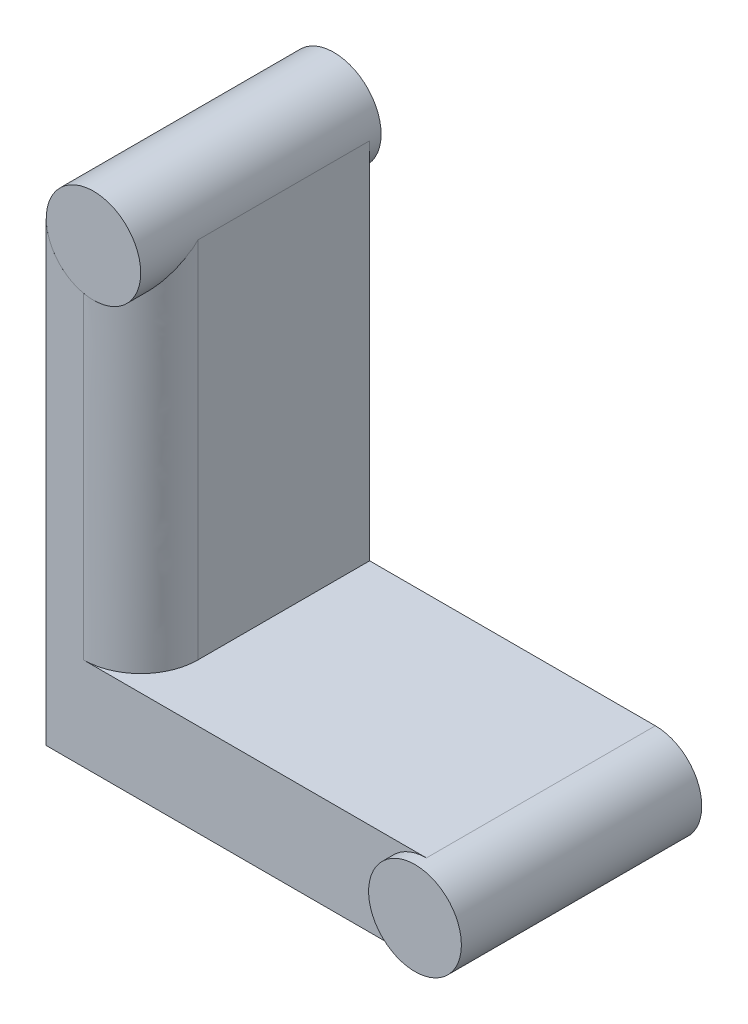
ISO-10303-21;
HEADER;
FILE_DESCRIPTION(('STEP AP214'),'2;1');
FILE_NAME('part.step','',(''),(''),'','','');
FILE_SCHEMA(('AUTOMOTIVE_DESIGN { 1 0 10303 214 1 1 1 1 }'));
ENDSEC;
DATA;
#1=APPLICATION_CONTEXT('core data for automotive mechanical design processes');
#2=APPLICATION_PROTOCOL_DEFINITION('international standard','automotive_design',2000,#1);
#3=PRODUCT_CONTEXT('',#1,'mechanical');
#4=PRODUCT('Part','Part','',(#3));
#5=PRODUCT_RELATED_PRODUCT_CATEGORY('part','',(#4));
#6=PRODUCT_DEFINITION_FORMATION('','',#4);
#7=PRODUCT_DEFINITION_CONTEXT('part definition',#1,'design');
#8=PRODUCT_DEFINITION('design','',#6,#7);
#9=PRODUCT_DEFINITION_SHAPE('','',#8);
#10=(LENGTH_UNIT() NAMED_UNIT(*) SI_UNIT(.MILLI.,.METRE.));
#11=(NAMED_UNIT(*) PLANE_ANGLE_UNIT() SI_UNIT($,.RADIAN.));
#12=(NAMED_UNIT(*) SI_UNIT($,.STERADIAN.) SOLID_ANGLE_UNIT());
#13=UNCERTAINTY_MEASURE_WITH_UNIT(LENGTH_MEASURE(1.E-05),#10,'distance_accuracy_value','');
#14=(GEOMETRIC_REPRESENTATION_CONTEXT(3) GLOBAL_UNCERTAINTY_ASSIGNED_CONTEXT((#13)) GLOBAL_UNIT_ASSIGNED_CONTEXT((#10,
#11,#12)) REPRESENTATION_CONTEXT('',''));
#15=CARTESIAN_POINT('',(0.,0.,0.));
#16=DIRECTION('',(0.,0.,1.));
#17=DIRECTION('',(1.,0.,0.));
#18=AXIS2_PLACEMENT_3D('',#15,#16,#17);
#19=CARTESIAN_POINT('',(8.25386471990466,37.4415375446961,-2.));
#20=DIRECTION('',(0.,0.,1.));
#21=DIRECTION('',(1.,0.,0.));
#22=AXIS2_PLACEMENT_3D('',#19,#20,#21);
#23=CYLINDRICAL_SURFACE('',#22,8.25386471990466);
#24=CARTESIAN_POINT('',(8.25386471990466,37.4415375446961,-2.));
#25=DIRECTION('',(0.,0.,1.));
#26=DIRECTION('',(1.,0.,0.));
#27=AXIS2_PLACEMENT_3D('',#24,#25,#26);
#28=CIRCLE('',#27,8.25386471990466);
#29=CARTESIAN_POINT('',(16.5077294398093,37.4415375446961,-2.));
#30=VERTEX_POINT('',#29);
#31=EDGE_CURVE('E11',#30,#30,#28,.T.);
#32=CARTESIAN_POINT('',(8.25386471990466,37.4415375446961,40.));
#33=DIRECTION('',(0.,0.,1.));
#34=DIRECTION('',(1.,0.,0.));
#35=AXIS2_PLACEMENT_3D('',#32,#33,#34);
#36=CIRCLE('',#35,8.25386471990466);
#37=CARTESIAN_POINT('',(16.5077294398093,37.4415375446961,40.));
#38=VERTEX_POINT('',#37);
#39=EDGE_CURVE('E52',#38,#38,#36,.T.);
#40=CARTESIAN_POINT('',(16.5077294398093,37.4415375446961,-2.));
#41=CARTESIAN_POINT('',(16.5077294398093,37.4415375446961,-1.5625));
#42=CARTESIAN_POINT('',(16.5077294398093,37.4415375446961,-1.125));
#43=CARTESIAN_POINT('',(16.5077294398093,37.4415375446961,-0.250000000000002));
#44=CARTESIAN_POINT('',(16.5077294398093,37.4415375446961,0.187499999999998));
#45=CARTESIAN_POINT('',(16.5077294398093,37.4415375446961,1.0625));
#46=CARTESIAN_POINT('',(16.5077294398093,37.4415375446961,1.5));
#47=CARTESIAN_POINT('',(16.5077294398093,37.4415375446961,2.375));
#48=CARTESIAN_POINT('',(16.5077294398093,37.4415375446961,2.8125));
#49=CARTESIAN_POINT('',(16.5077294398093,37.4415375446961,3.6875));
#50=CARTESIAN_POINT('',(16.5077294398093,37.4415375446961,4.125));
#51=CARTESIAN_POINT('',(16.5077294398093,37.4415375446961,5.));
#52=CARTESIAN_POINT('',(16.5077294398093,37.4415375446961,5.4375));
#53=CARTESIAN_POINT('',(16.5077294398093,37.4415375446961,6.3125));
#54=CARTESIAN_POINT('',(16.5077294398093,37.4415375446961,6.75));
#55=CARTESIAN_POINT('',(16.5077294398093,37.4415375446961,7.625));
#56=CARTESIAN_POINT('',(16.5077294398093,37.4415375446961,8.0625));
#57=CARTESIAN_POINT('',(16.5077294398093,37.4415375446961,8.9375));
#58=CARTESIAN_POINT('',(16.5077294398093,37.4415375446961,9.375));
#59=CARTESIAN_POINT('',(16.5077294398093,37.4415375446961,10.25));
#60=CARTESIAN_POINT('',(16.5077294398093,37.4415375446961,10.6875));
#61=CARTESIAN_POINT('',(16.5077294398093,37.4415375446961,11.5625));
#62=CARTESIAN_POINT('',(16.5077294398093,37.4415375446961,12.));
#63=CARTESIAN_POINT('',(16.5077294398093,37.4415375446961,12.875));
#64=CARTESIAN_POINT('',(16.5077294398093,37.4415375446961,13.3125));
#65=CARTESIAN_POINT('',(16.5077294398093,37.4415375446961,14.1875));
#66=CARTESIAN_POINT('',(16.5077294398093,37.4415375446961,14.625));
#67=CARTESIAN_POINT('',(16.5077294398093,37.4415375446961,15.5));
#68=CARTESIAN_POINT('',(16.5077294398093,37.4415375446961,15.9375));
#69=CARTESIAN_POINT('',(16.5077294398093,37.4415375446961,16.8125));
#70=CARTESIAN_POINT('',(16.5077294398093,37.4415375446961,17.25));
#71=CARTESIAN_POINT('',(16.5077294398093,37.4415375446961,18.125));
#72=CARTESIAN_POINT('',(16.5077294398093,37.4415375446961,18.5625));
#73=CARTESIAN_POINT('',(16.5077294398093,37.4415375446961,19.4375));
#74=CARTESIAN_POINT('',(16.5077294398093,37.4415375446961,19.875));
#75=CARTESIAN_POINT('',(16.5077294398093,37.4415375446961,20.75));
#76=CARTESIAN_POINT('',(16.5077294398093,37.4415375446961,21.1875));
#77=CARTESIAN_POINT('',(16.5077294398093,37.4415375446961,22.0625));
#78=CARTESIAN_POINT('',(16.5077294398093,37.4415375446961,22.5));
#79=CARTESIAN_POINT('',(16.5077294398093,37.4415375446961,23.375));
#80=CARTESIAN_POINT('',(16.5077294398093,37.4415375446961,23.8125));
#81=CARTESIAN_POINT('',(16.5077294398093,37.4415375446961,24.6875));
#82=CARTESIAN_POINT('',(16.5077294398093,37.4415375446961,25.125));
#83=CARTESIAN_POINT('',(16.5077294398093,37.4415375446961,26.));
#84=CARTESIAN_POINT('',(16.5077294398093,37.4415375446961,26.4375));
#85=CARTESIAN_POINT('',(16.5077294398093,37.4415375446961,27.3125));
#86=CARTESIAN_POINT('',(16.5077294398093,37.4415375446961,27.75));
#87=CARTESIAN_POINT('',(16.5077294398093,37.4415375446961,28.625));
#88=CARTESIAN_POINT('',(16.5077294398093,37.4415375446961,29.0625));
#89=CARTESIAN_POINT('',(16.5077294398093,37.4415375446961,29.9375));
#90=CARTESIAN_POINT('',(16.5077294398093,37.4415375446961,30.375));
#91=CARTESIAN_POINT('',(16.5077294398093,37.4415375446961,31.25));
#92=CARTESIAN_POINT('',(16.5077294398093,37.4415375446961,31.6875));
#93=CARTESIAN_POINT('',(16.5077294398093,37.4415375446961,32.5625));
#94=CARTESIAN_POINT('',(16.5077294398093,37.4415375446961,33.));
#95=CARTESIAN_POINT('',(16.5077294398093,37.4415375446961,33.875));
#96=CARTESIAN_POINT('',(16.5077294398093,37.4415375446961,34.3125));
#97=CARTESIAN_POINT('',(16.5077294398093,37.4415375446961,35.1875));
#98=CARTESIAN_POINT('',(16.5077294398093,37.4415375446961,35.625));
#99=CARTESIAN_POINT('',(16.5077294398093,37.4415375446961,36.5));
#100=CARTESIAN_POINT('',(16.5077294398093,37.4415375446961,36.9375));
#101=CARTESIAN_POINT('',(16.5077294398093,37.4415375446961,37.8125));
#102=CARTESIAN_POINT('',(16.5077294398093,37.4415375446961,38.25));
#103=CARTESIAN_POINT('',(16.5077294398093,37.4415375446961,39.125));
#104=CARTESIAN_POINT('',(16.5077294398093,37.4415375446961,39.5625));
#105=CARTESIAN_POINT('',(16.5077294398093,37.4415375446961,40.));
#106=B_SPLINE_CURVE_WITH_KNOTS('',3,(#40,#41,#42,#43,#44,#45,#46,#47,#48,#49,#50,#51,#52,#53,
#54,#55,#56,#57,#58,#59,#60,#61,#62,#63,#64,#65,#66,#67,#68,#69,#70,#71,#72,#73,#74,#75,#76,#77,
#78,#79,#80,#81,#82,#83,#84,#85,#86,#87,#88,#89,#90,#91,#92,#93,#94,#95,#96,#97,#98,#99,#100,
#101,#102,#103,#104,#105),.UNSPECIFIED.,.F.,.F.,(4,2,2,2,2,2,2,2,2,2,2,2,2,2,2,2,2,2,2,2,2,2,2,
2,2,2,2,2,2,2,2,2,4),(0.,1.3125,2.625,3.9375,5.25,6.5625,7.875,9.1875,10.5,11.8125,13.125,
14.4375,15.75,17.0625,18.375,19.6875,21.,22.3125,23.625,24.9375,26.25,27.5625,28.875,30.1875,
31.5,32.8125,34.125,35.4375,36.75,38.0625,39.375,40.6875,42.),.UNSPECIFIED.);
#107=EDGE_CURVE('BSEAM49',#30,#38,#106,.T.);
#108=ORIENTED_EDGE('',*,*,#31,.T.);
#109=ORIENTED_EDGE('',*,*,#39,.F.);
#110=ORIENTED_EDGE('',*,*,#107,.T.);
#111=ORIENTED_EDGE('',*,*,#107,.F.);
#112=EDGE_LOOP('',(#108,#110,#109,#111));
#113=FACE_BOUND('',#112,.T.);
#114=ADVANCED_FACE('F49',(#113),#23,.T.);
#115=CARTESIAN_POINT('',(8.25386471990466,37.4415375446961,-2.));
#116=DIRECTION('',(0.,0.,1.));
#117=DIRECTION('',(1.,0.,0.));
#118=AXIS2_PLACEMENT_3D('',#115,#116,#117);
#119=PLANE('',#118);
#120=ORIENTED_EDGE('',*,*,#31,.F.);
#121=EDGE_LOOP('',(#120));
#122=FACE_BOUND('',#121,.T.);
#123=ADVANCED_FACE('F63',(#122),#119,.F.);
#124=CARTESIAN_POINT('',(8.25386471990466,37.4415375446961,40.));
#125=DIRECTION('',(0.,0.,1.));
#126=DIRECTION('',(1.,0.,0.));
#127=AXIS2_PLACEMENT_3D('',#124,#125,#126);
#128=PLANE('',#127);
#129=ORIENTED_EDGE('',*,*,#39,.T.);
#130=EDGE_LOOP('',(#129));
#131=FACE_BOUND('',#130,.T.);
#132=ADVANCED_FACE('F65',(#131),#128,.T.);
#133=CLOSED_SHELL('',(#114,#123,#132));
#134=MANIFOLD_SOLID_BREP('B2',#133);
#135=CARTESIAN_POINT('',(0.,-42.330810488677,40.));
#136=DIRECTION('',(0.,1.,0.));
#137=DIRECTION('',(0.,0.,1.));
#138=AXIS2_PLACEMENT_3D('',#135,#136,#137);
#139=PLANE('',#138);
#140=DIRECTION('',(1.,0.,0.));
#141=VECTOR('',#140,1.);
#142=CARTESIAN_POINT('',(0.,-42.330810488677,0.));
#143=LINE('',#142,#141);
#144=CARTESIAN_POINT('',(0.,-42.330810488677,0.));
#145=VERTEX_POINT('',#144);
#146=CARTESIAN_POINT('',(66.429779499404,-42.330810488677,0.));
#147=VERTEX_POINT('',#146);
#148=EDGE_CURVE('E183',#145,#147,#143,.T.);
#149=ORIENTED_EDGE('',*,*,#148,.T.);
#150=DIRECTION('',(0.,0.,-1.));
#151=VECTOR('',#150,1.);
#152=CARTESIAN_POINT('',(66.429779499404,-42.330810488677,40.));
#153=LINE('',#152,#151);
#154=CARTESIAN_POINT('',(66.429779499404,-42.330810488677,40.));
#155=VERTEX_POINT('',#154);
#156=EDGE_CURVE('E165',#155,#147,#153,.T.);
#157=ORIENTED_EDGE('',*,*,#156,.F.);
#158=DIRECTION('',(1.,0.,0.));
#159=VECTOR('',#158,1.);
#160=CARTESIAN_POINT('',(0.,-42.330810488677,40.));
#161=LINE('',#160,#159);
#162=CARTESIAN_POINT('',(0.,-42.330810488677,40.));
#163=VERTEX_POINT('',#162);
#164=EDGE_CURVE('E191',#163,#155,#161,.T.);
#165=ORIENTED_EDGE('',*,*,#164,.F.);
#166=DIRECTION('',(0.,0.,-1.));
#167=VECTOR('',#166,1.);
#168=CARTESIAN_POINT('',(0.,-42.330810488677,40.));
#169=LINE('',#168,#167);
#170=EDGE_CURVE('E193',#163,#145,#169,.T.);
#171=ORIENTED_EDGE('',*,*,#170,.T.);
#172=EDGE_LOOP('',(#149,#157,#165,#171));
#173=FACE_BOUND('',#172,.T.);
#174=ADVANCED_FACE('F95',(#173),#139,.F.);
#175=CARTESIAN_POINT('',(66.429779499404,-26.119010727056,40.));
#176=DIRECTION('',(0.,-1.,0.));
#177=DIRECTION('',(0.,0.,-1.));
#178=AXIS2_PLACEMENT_3D('',#175,#176,#177);
#179=PLANE('',#178);
#180=DIRECTION('',(-1.,0.,0.));
#181=VECTOR('',#180,1.);
#182=CARTESIAN_POINT('',(66.429779499404,-26.119010727056,0.));
#183=LINE('',#182,#181);
#184=CARTESIAN_POINT('',(66.429779499404,-26.119010727056,0.));
#185=VERTEX_POINT('',#184);
#186=CARTESIAN_POINT('',(16.5077294398093,-26.119010727056,0.));
#187=VERTEX_POINT('',#186);
#188=EDGE_CURVE('E174',#185,#187,#183,.T.);
#189=ORIENTED_EDGE('',*,*,#188,.T.);
#190=DIRECTION('',(0.,0.,-1.));
#191=VECTOR('',#190,1.);
#192=CARTESIAN_POINT('',(16.5077294398093,-26.119010727056,40.));
#193=LINE('',#192,#191);
#194=CARTESIAN_POINT('',(16.5077294398093,-26.119010727056,30.));
#195=VERTEX_POINT('',#194);
#196=EDGE_CURVE('E178',#195,#187,#193,.T.);
#197=ORIENTED_EDGE('',*,*,#196,.F.);
#198=CARTESIAN_POINT('',(6.50772943980932,-26.119010727056,40.));
#199=CARTESIAN_POINT('',(16.5077294398093,-26.119010727056,40.));
#200=CARTESIAN_POINT('',(16.5077294398093,-26.119010727056,30.));
#201=(BOUNDED_CURVE() B_SPLINE_CURVE(2,(#198,#199,#200),.UNSPECIFIED.,.F.,
.F.) B_SPLINE_CURVE_WITH_KNOTS((3,3),(0.,1.),
.UNSPECIFIED.) CURVE() GEOMETRIC_REPRESENTATION_ITEM() RATIONAL_B_SPLINE_CURVE((1.,
0.707106781186548,1.)) REPRESENTATION_ITEM(''));
#202=CARTESIAN_POINT('',(6.50772943980932,-26.119010727056,40.));
#203=VERTEX_POINT('',#202);
#204=EDGE_CURVE('E48',#195,#203,#201,.F.);
#205=ORIENTED_EDGE('',*,*,#204,.T.);
#206=DIRECTION('',(-1.,0.,0.));
#207=VECTOR('',#206,1.);
#208=CARTESIAN_POINT('',(66.429779499404,-26.119010727056,40.));
#209=LINE('',#208,#207);
#210=CARTESIAN_POINT('',(66.429779499404,-26.119010727056,40.));
#211=VERTEX_POINT('',#210);
#212=EDGE_CURVE('E180',#211,#203,#209,.T.);
#213=ORIENTED_EDGE('',*,*,#212,.F.);
#214=DIRECTION('',(0.,0.,-1.));
#215=VECTOR('',#214,1.);
#216=CARTESIAN_POINT('',(66.429779499404,-26.119010727056,40.));
#217=LINE('',#216,#215);
#218=EDGE_CURVE('E163',#211,#185,#217,.T.);
#219=ORIENTED_EDGE('',*,*,#218,.T.);
#220=EDGE_LOOP('',(#189,#197,#205,#213,#219));
#221=FACE_BOUND('',#220,.T.);
#222=ADVANCED_FACE('F172',(#221),#179,.F.);
#223=CARTESIAN_POINT('',(16.5077294398093,-26.119010727056,40.));
#224=DIRECTION('',(-1.,0.,0.));
#225=DIRECTION('',(0.,0.,1.));
#226=AXIS2_PLACEMENT_3D('',#223,#224,#225);
#227=PLANE('',#226);
#228=DIRECTION('',(0.,0.,-1.));
#229=VECTOR('',#228,1.);
#230=CARTESIAN_POINT('',(16.5077294398093,37.4415375446961,40.));
#231=LINE('',#230,#229);
#232=CARTESIAN_POINT('',(16.5077294398093,37.4415375446961,30.));
#233=VERTEX_POINT('',#232);
#234=CARTESIAN_POINT('',(16.5077294398093,37.4415375446961,0.));
#235=VERTEX_POINT('',#234);
#236=EDGE_CURVE('E204',#233,#235,#231,.T.);
#237=ORIENTED_EDGE('',*,*,#236,.F.);
#238=CARTESIAN_POINT('',(16.5077294398093,-29.2970381406436,30.));
#239=CARTESIAN_POINT('',(16.5077294398093,-5.99150377433455,30.));
#240=CARTESIAN_POINT('',(16.5077294398093,17.3140305919746,30.));
#241=CARTESIAN_POINT('',(16.5077294398093,40.6195649582837,30.));
#242=(BOUNDED_CURVE() B_SPLINE_CURVE(3,(#238,#239,#240,#241),.UNSPECIFIED.,.F.,
.F.) B_SPLINE_CURVE_WITH_KNOTS((4,4),(-0.0748444755661502,-0.00492787246722289),
.UNSPECIFIED.) CURVE() GEOMETRIC_REPRESENTATION_ITEM() RATIONAL_B_SPLINE_CURVE((1.,1.,1.,1.)) REPRESENTATION_ITEM(''));
#243=EDGE_CURVE('E106',#233,#195,#242,.F.);
#244=ORIENTED_EDGE('',*,*,#243,.T.);
#245=ORIENTED_EDGE('',*,*,#196,.T.);
#246=DIRECTION('',(0.,1.,0.));
#247=VECTOR('',#246,1.);
#248=CARTESIAN_POINT('',(16.5077294398093,-26.119010727056,0.));
#249=LINE('',#248,#247);
#250=EDGE_CURVE('E182',#187,#235,#249,.T.);
#251=ORIENTED_EDGE('',*,*,#250,.T.);
#252=EDGE_LOOP('',(#237,#244,#245,#251));
#253=FACE_BOUND('',#252,.T.);
#254=ADVANCED_FACE('F226',(#253),#227,.F.);
#255=CARTESIAN_POINT('',(8.25386471990466,37.4415375446961,40.));
#256=DIRECTION('',(0.,0.,-1.));
#257=DIRECTION('',(-1.,0.,0.));
#258=AXIS2_PLACEMENT_3D('',#255,#256,#257);
#259=CYLINDRICAL_SURFACE('',#258,8.25386471990466);
#260=CARTESIAN_POINT('',(8.25386471990466,37.4415375446961,40.));
#261=DIRECTION('',(0.,0.,-1.));
#262=DIRECTION('',(1.,0.,0.));
#263=AXIS2_PLACEMENT_3D('',#260,#261,#262);
#264=CIRCLE('',#263,8.25386471990466);
#265=CARTESIAN_POINT('',(6.50772943980932,29.3744876255439,40.));
#266=VERTEX_POINT('',#265);
#267=CARTESIAN_POINT('',(0.,37.4415375446961,40.));
#268=VERTEX_POINT('',#267);
#269=EDGE_CURVE('E292',#266,#268,#264,.T.);
#270=ORIENTED_EDGE('',*,*,#269,.F.);
#271=CARTESIAN_POINT('',(16.5077294398093,37.4415375446961,30.));
#272=CARTESIAN_POINT('',(16.5077248458745,37.2595049508571,30.2000988227831));
#273=CARTESIAN_POINT('',(16.5017228505918,37.0775374470663,30.4002980999907));
#274=CARTESIAN_POINT('',(16.4755496817082,36.6822347240723,30.8355179167807));
#275=CARTESIAN_POINT('',(16.4530784878085,36.468994249373,31.0704887071536));
#276=CARTESIAN_POINT('',(16.4050259976996,36.1378815098516,31.4355787114182));
#277=CARTESIAN_POINT('',(16.3852221507021,36.0195676178505,31.566080489722));
#278=CARTESIAN_POINT('',(16.3438051112881,35.8016376004174,31.8066972215504));
#279=CARTESIAN_POINT('',(16.32293639335,35.7019393701873,31.916866345903));
#280=CARTESIAN_POINT('',(16.2542027129735,35.4019745325798,32.2489066646719));
#281=CARTESIAN_POINT('',(16.2004731385662,35.2025882306316,32.4703864558893));
#282=CARTESIAN_POINT('',(16.0768845936266,34.8032602401186,32.912852440165));
#283=CARTESIAN_POINT('',(16.0068573473511,34.6033358964416,33.1338073470961));
#284=CARTESIAN_POINT('',(15.8836828257588,34.290078452645,33.479886499956));
#285=CARTESIAN_POINT('',(15.8358878020273,34.1758166445561,33.6060923000747));
#286=CARTESIAN_POINT('',(15.7360999790361,33.9523449591851,33.8541525205278));
#287=CARTESIAN_POINT('',(15.6842696811532,33.8430847996684,33.9760267482048));
#288=CARTESIAN_POINT('',(15.5769249978851,33.6294096729469,34.2150135185041));
#289=CARTESIAN_POINT('',(15.5215720528584,33.5249487968916,34.332157581448));
#290=CARTESIAN_POINT('',(15.4076285346949,33.3209273094051,34.5615410883732));
#291=CARTESIAN_POINT('',(15.3491998284411,33.2213172786882,34.6738169147606));
#292=CARTESIAN_POINT('',(15.2295746549551,33.0269858533153,34.8933124051639));
#293=CARTESIAN_POINT('',(15.1685392056293,32.9322132189256,35.0005744278812));
#294=CARTESIAN_POINT('',(15.0441634527872,32.7475624646291,35.2099508267381));
#295=CARTESIAN_POINT('',(14.9809828955282,32.6576303058797,35.3121123921762));
#296=CARTESIAN_POINT('',(14.85277392755,32.4826626673306,35.5112361981394));
#297=CARTESIAN_POINT('',(14.7879034722707,32.3975699768295,35.608249818404));
#298=CARTESIAN_POINT('',(14.6567603519189,32.2322844872376,35.7970667558746));
#299=CARTESIAN_POINT('',(14.5906434724883,32.1520306815793,35.8889248200974));
#300=CARTESIAN_POINT('',(14.4574360556099,31.9964287875268,36.0674583007036));
#301=CARTESIAN_POINT('',(14.3904989451791,31.9210150992567,36.1541909142974));
#302=CARTESIAN_POINT('',(14.2560673321231,31.7750923030995,36.3225275725097));
#303=CARTESIAN_POINT('',(14.188723487854,31.704512482722,36.4041906846809));
#304=CARTESIAN_POINT('',(14.02588352777,31.5400351948506,36.5953230531538));
#305=CARTESIAN_POINT('',(13.9289723319236,31.4468796642367,36.7042312147257));
#306=CARTESIAN_POINT('',(13.7314997997761,31.2664492100849,36.9164736548788));
#307=CARTESIAN_POINT('',(13.6310970770488,31.1790845833811,37.0198792463658));
#308=CARTESIAN_POINT('',(13.4270883880916,31.0102284816472,37.2209720255227));
#309=CARTESIAN_POINT('',(13.3236385571316,30.9286426125707,37.3187381542093));
#310=CARTESIAN_POINT('',(13.1139816114022,30.7713523262215,37.5084531413826));
#311=CARTESIAN_POINT('',(13.0079273477588,30.6955480697688,37.6004879740986));
#312=CARTESIAN_POINT('',(12.7935048582451,30.5498257170314,37.7786830658109));
#313=CARTESIAN_POINT('',(12.6852852997725,30.479802094411,37.8649357205054));
#314=CARTESIAN_POINT('',(12.4669677109047,30.3456471562464,38.0315495607575));
#315=CARTESIAN_POINT('',(12.3570132696058,30.2814042852117,38.1120088480935));
#316=CARTESIAN_POINT('',(12.1356502357391,30.1588168551712,38.2670567605626));
#317=CARTESIAN_POINT('',(12.0243792225154,30.1003544718486,38.3417484066642));
#318=CARTESIAN_POINT('',(11.8007916072898,29.9893350614954,38.4853174056651));
#319=CARTESIAN_POINT('',(11.6886056529586,29.9366537593291,38.5543018145895));
#320=CARTESIAN_POINT('',(11.4635823365175,29.837201111678,38.6865432637737));
#321=CARTESIAN_POINT('',(11.350867613634,29.7902990954355,38.7499104896187));
#322=CARTESIAN_POINT('',(11.1251492971688,29.7024187789291,38.8710389087928));
#323=CARTESIAN_POINT('',(11.0122596808964,29.6613033019315,38.9289122148364));
#324=CARTESIAN_POINT('',(10.8274949287463,29.5988163053026,39.0191865407517));
#325=CARTESIAN_POINT('',(10.7566875306456,29.575970295882,39.0527639594989));
#326=CARTESIAN_POINT('',(10.6144346453965,29.5322576505255,39.1181713854532));
#327=CARTESIAN_POINT('',(10.5429993673214,29.5113761287898,39.1500136059733));
#328=CARTESIAN_POINT('',(10.3995556233159,29.4715984048943,39.2119347560961));
#329=CARTESIAN_POINT('',(10.3275565191052,29.4526874612271,39.2420259022483));
#330=CARTESIAN_POINT('',(10.1830500419615,29.4168490669232,39.3004324465357));
#331=CARTESIAN_POINT('',(10.1105511778132,29.3999071269259,39.3287599950901));
#332=CARTESIAN_POINT('',(9.96511039714302,29.3680069135871,39.3836299714177));
#333=CARTESIAN_POINT('',(9.89217613253337,29.3530344347592,39.4101844147463));
#334=CARTESIAN_POINT('',(9.7459297529256,29.3250727271762,39.4615019690518));
#335=CARTESIAN_POINT('',(9.67262443605925,29.3120696324041,39.4862768895923));
#336=CARTESIAN_POINT('',(9.52570098712542,29.2880463675539,39.5340322984906));
#337=CARTESIAN_POINT('',(9.45208880887966,29.2770127244502,39.55702431831));
#338=CARTESIAN_POINT('',(9.30461631506359,29.2569279442845,39.6012139055103));
#339=CARTESIAN_POINT('',(9.23076112573141,29.2478637850186,39.6224226535354));
#340=CARTESIAN_POINT('',(9.08286675514416,29.2317175057294,39.663048704072));
#341=CARTESIAN_POINT('',(9.00883189696318,29.2246228744264,39.6824767638414));
#342=CARTESIAN_POINT('',(8.86064162880272,29.212415120852,39.7195474098922));
#343=CARTESIAN_POINT('',(8.78648977132169,29.2072900605906,39.7372002583827));
#344=CARTESIAN_POINT('',(8.6381280735163,29.1990208567975,39.7707293451115));
#345=CARTESIAN_POINT('',(8.56392105623575,29.1958654125342,39.786615280612));
#346=CARTESIAN_POINT('',(8.41551057745767,29.1915347839178,39.8166222115262));
#347=CARTESIAN_POINT('',(8.34130925946333,29.1903490010335,39.8307522720412));
#348=CARTESIAN_POINT('',(8.19297053619661,29.1899569734499,39.8572618355984));
#349=CARTESIAN_POINT('',(8.11883465371804,29.1907408975613,39.8696497080281));
#350=CARTESIAN_POINT('',(7.97068583361382,29.1942874966458,39.8926918877565));
#351=CARTESIAN_POINT('',(7.89667386578881,29.1970411722527,39.903353809845));
#352=CARTESIAN_POINT('',(7.74883044880752,29.2045264246563,39.9229635764679));
#353=CARTESIAN_POINT('',(7.67499949284495,29.2092498967622,39.9319182280207));
#354=CARTESIAN_POINT('',(7.52757408910173,29.2206738233592,39.9481353269799));
#355=CARTESIAN_POINT('',(7.45397974256247,29.2273671280744,39.9554037271355));
#356=CARTESIAN_POINT('',(7.30708185479676,29.2427297670211,39.9682724197006));
#357=CARTESIAN_POINT('',(7.23377811513426,29.2513929627976,39.9738777719084));
#358=CARTESIAN_POINT('',(7.08751391945207,29.2706942816181,39.9834466931651));
#359=CARTESIAN_POINT('',(7.01455306446181,29.2813273294496,39.9874143985815));
#360=CARTESIAN_POINT('',(6.86902528953379,29.304567549441,39.9937359337908));
#361=CARTESIAN_POINT('',(6.79645787478294,29.3171707545911,39.9960929566261));
#362=CARTESIAN_POINT('',(6.65176540853596,29.3443491419823,39.9992243693447));
#363=CARTESIAN_POINT('',(6.57963987611879,29.3589215063253,40.0000009957525));
#364=CARTESIAN_POINT('',(6.50772943980932,29.3744876255439,40.));
#365=B_SPLINE_CURVE_WITH_KNOTS('',3,(#271,#272,#273,#274,#275,#276,#277,#278,#279,#280,#281,
#282,#283,#284,#285,#286,#287,#288,#289,#290,#291,#292,#293,#294,#295,#296,#297,#298,#299,#300,
#301,#302,#303,#304,#305,#306,#307,#308,#309,#310,#311,#312,#313,#314,#315,#316,#317,#318,#319,
#320,#321,#322,#323,#324,#325,#326,#327,#328,#329,#330,#331,#332,#333,#334,#335,#336,#337,#338,
#339,#340,#341,#342,#343,#344,#345,#346,#347,#348,#349,#350,#351,#352,#353,#354,#355,#356,#357,
#358,#359,#360,#361,#362,#363,#364),.UNSPECIFIED.,.F.,.F.,(4,2,2,2,2,2,2,2,2,2,2,2,2,2,2,2,2,2,
2,2,2,2,2,2,2,2,2,2,2,2,2,2,2,2,2,2,2,2,2,2,2,2,2,2,2,2,4),(0.,0.811526541933476,
1.76535439523514,2.29706246334846,2.74714547377275,3.6551458386808,4.57297355389326,
5.10337219211141,5.61834589725974,6.11754823022304,6.60065987911765,7.06739088758487,
7.51748245324622,7.95070834871568,8.3668760353978,8.76582755765556,9.14744032273817,
9.66628289808401,10.1717434148532,10.6637653057612,11.142327088506,11.6074468643261,
12.0591868236434,12.4976577782509,12.9230237387867,13.3355065492455,13.7353905751753,
13.9802355416543,14.2230435713084,14.4638803650935,14.7028145485505,14.9399178478088,
15.1752652556022,15.4089351850218,15.6410096086832,15.8715741809686,16.1007183410259,
16.3285353942587,16.5551225701469,16.7805810543853,17.0050159935291,17.2285364705924,
17.4512554503554,17.6732896935018,17.8947596391185,18.1157892555492,18.3365058600809),.UNSPECIFIED.);
#366=EDGE_CURVE('E122',#266,#233,#365,.F.);
#367=ORIENTED_EDGE('',*,*,#366,.T.);
#368=ORIENTED_EDGE('',*,*,#236,.T.);
#369=CARTESIAN_POINT('',(8.25386471990466,37.4415375446961,0.));
#370=DIRECTION('',(0.,0.,-1.));
#371=DIRECTION('',(1.,0.,0.));
#372=AXIS2_PLACEMENT_3D('',#369,#370,#371);
#373=CIRCLE('',#372,8.25386471990466);
#374=CARTESIAN_POINT('',(0.,37.4415375446961,0.));
#375=VERTEX_POINT('',#374);
#376=EDGE_CURVE('E187',#235,#375,#373,.T.);
#377=ORIENTED_EDGE('',*,*,#376,.T.);
#378=DIRECTION('',(0.,0.,-1.));
#379=VECTOR('',#378,1.);
#380=CARTESIAN_POINT('',(0.,37.4415375446961,40.));
#381=LINE('',#380,#379);
#382=EDGE_CURVE('E198',#268,#375,#381,.T.);
#383=ORIENTED_EDGE('',*,*,#382,.F.);
#384=EDGE_LOOP('',(#270,#367,#368,#377,#383));
#385=FACE_BOUND('',#384,.T.);
#386=ADVANCED_FACE('F220',(#385),#259,.F.);
#387=CARTESIAN_POINT('',(0.,37.4415375446961,40.));
#388=DIRECTION('',(1.,0.,0.));
#389=DIRECTION('',(0.,0.,-1.));
#390=AXIS2_PLACEMENT_3D('',#387,#388,#389);
#391=PLANE('',#390);
#392=DIRECTION('',(0.,-1.,0.));
#393=VECTOR('',#392,1.);
#394=CARTESIAN_POINT('',(0.,37.4415375446961,0.));
#395=LINE('',#394,#393);
#396=EDGE_CURVE('E195',#375,#145,#395,.T.);
#397=ORIENTED_EDGE('',*,*,#396,.T.);
#398=ORIENTED_EDGE('',*,*,#170,.F.);
#399=DIRECTION('',(0.,-1.,0.));
#400=VECTOR('',#399,1.);
#401=CARTESIAN_POINT('',(0.,37.4415375446961,40.));
#402=LINE('',#401,#400);
#403=EDGE_CURVE('E197',#268,#163,#402,.T.);
#404=ORIENTED_EDGE('',*,*,#403,.F.);
#405=ORIENTED_EDGE('',*,*,#382,.T.);
#406=EDGE_LOOP('',(#397,#398,#404,#405));
#407=FACE_BOUND('',#406,.T.);
#408=ADVANCED_FACE('F227',(#407),#391,.F.);
#409=CARTESIAN_POINT('',(66.429779499404,-34.2249106078665,40.));
#410=DIRECTION('',(0.,0.,1.));
#411=DIRECTION('',(1.,0.,0.));
#412=AXIS2_PLACEMENT_3D('',#409,#410,#411);
#413=PLANE('',#412);
#414=ORIENTED_EDGE('',*,*,#212,.T.);
#415=CARTESIAN_POINT('',(6.50772943980932,40.6195649582837,40.));
#416=CARTESIAN_POINT('',(6.50772943980932,17.3140305919746,40.));
#417=CARTESIAN_POINT('',(6.50772943980932,-5.99150377433455,40.));
#418=CARTESIAN_POINT('',(6.50772943980932,-29.2970381406436,40.));
#419=(BOUNDED_CURVE() B_SPLINE_CURVE(3,(#415,#416,#417,#418),.UNSPECIFIED.,.F.,
.F.) B_SPLINE_CURVE_WITH_KNOTS((4,4),(-0.0748444755661502,-0.00492787246722289),
.UNSPECIFIED.) CURVE() GEOMETRIC_REPRESENTATION_ITEM() RATIONAL_B_SPLINE_CURVE((1.,1.,1.,1.)) REPRESENTATION_ITEM(''));
#420=EDGE_CURVE('E267',#203,#266,#419,.F.);
#421=ORIENTED_EDGE('',*,*,#420,.T.);
#422=ORIENTED_EDGE('',*,*,#269,.T.);
#423=ORIENTED_EDGE('',*,*,#403,.T.);
#424=ORIENTED_EDGE('',*,*,#164,.T.);
#425=CARTESIAN_POINT('',(66.429779499404,-34.2249106078665,40.));
#426=DIRECTION('',(0.,0.,-1.));
#427=DIRECTION('',(1.,0.,0.));
#428=AXIS2_PLACEMENT_3D('',#425,#426,#427);
#429=CIRCLE('',#428,8.10589988081049);
#430=EDGE_CURVE('E291',#155,#211,#429,.T.);
#431=ORIENTED_EDGE('',*,*,#430,.T.);
#432=EDGE_LOOP('',(#414,#421,#422,#423,#424,#431));
#433=FACE_BOUND('',#432,.T.);
#434=ADVANCED_FACE('F305',(#433),#413,.T.);
#435=CARTESIAN_POINT('',(66.429779499404,-34.2249106078665,0.));
#436=DIRECTION('',(0.,0.,1.));
#437=DIRECTION('',(1.,0.,0.));
#438=AXIS2_PLACEMENT_3D('',#435,#436,#437);
#439=PLANE('',#438);
#440=ORIENTED_EDGE('',*,*,#148,.F.);
#441=ORIENTED_EDGE('',*,*,#396,.F.);
#442=ORIENTED_EDGE('',*,*,#376,.F.);
#443=ORIENTED_EDGE('',*,*,#250,.F.);
#444=ORIENTED_EDGE('',*,*,#188,.F.);
#445=CARTESIAN_POINT('',(66.429779499404,-34.2249106078665,0.));
#446=DIRECTION('',(0.,0.,1.));
#447=DIRECTION('',(1.,0.,0.));
#448=AXIS2_PLACEMENT_3D('',#445,#446,#447);
#449=CIRCLE('',#448,8.1058998808105);
#450=EDGE_CURVE('E159',#147,#185,#449,.T.);
#451=ORIENTED_EDGE('',*,*,#450,.F.);
#452=EDGE_LOOP('',(#440,#441,#442,#443,#444,#451));
#453=FACE_BOUND('',#452,.T.);
#454=ADVANCED_FACE('F179',(#453),#439,.F.);
#455=CARTESIAN_POINT('',(66.429779499404,-34.2249106078665,42.));
#456=DIRECTION('',(0.,0.,-1.));
#457=DIRECTION('',(-1.,0.,0.));
#458=AXIS2_PLACEMENT_3D('',#455,#456,#457);
#459=CYLINDRICAL_SURFACE('',#458,8.1058998808105);
#460=ORIENTED_EDGE('',*,*,#218,.F.);
#461=ORIENTED_EDGE('',*,*,#430,.F.);
#462=ORIENTED_EDGE('',*,*,#156,.T.);
#463=ORIENTED_EDGE('',*,*,#450,.T.);
#464=EDGE_LOOP('',(#460,#461,#462,#463));
#465=FACE_BOUND('',#464,.T.);
#466=CARTESIAN_POINT('',(66.429779499404,-34.2249106078665,42.));
#467=DIRECTION('',(0.,0.,1.));
#468=DIRECTION('',(1.,0.,0.));
#469=AXIS2_PLACEMENT_3D('',#466,#467,#468);
#470=CIRCLE('',#469,8.1058998808105);
#471=CARTESIAN_POINT('',(74.5356793802145,-34.2249106078665,42.));
#472=VERTEX_POINT('',#471);
#473=EDGE_CURVE('E169',#472,#472,#470,.T.);
#474=ORIENTED_EDGE('',*,*,#473,.F.);
#475=EDGE_LOOP('',(#474));
#476=FACE_BOUND('',#475,.T.);
#477=ADVANCED_FACE('F156',(#465,#476),#459,.T.);
#478=CARTESIAN_POINT('',(66.429779499404,-34.2249106078665,42.));
#479=DIRECTION('',(0.,0.,1.));
#480=DIRECTION('',(1.,0.,0.));
#481=AXIS2_PLACEMENT_3D('',#478,#479,#480);
#482=PLANE('',#481);
#483=ORIENTED_EDGE('',*,*,#473,.T.);
#484=EDGE_LOOP('',(#483));
#485=FACE_BOUND('',#484,.T.);
#486=ADVANCED_FACE('F324',(#485),#482,.T.);
#487=CARTESIAN_POINT('',(16.5077294398093,40.6195649582837,30.));
#488=CARTESIAN_POINT('',(16.5077294398093,17.3140305919746,30.));
#489=CARTESIAN_POINT('',(16.5077294398093,-5.99150377433455,30.));
#490=CARTESIAN_POINT('',(16.5077294398093,-29.2970381406436,30.));
#491=CARTESIAN_POINT('',(16.5077294398093,40.6195649582837,40.));
#492=CARTESIAN_POINT('',(16.5077294398093,17.3140305919746,40.));
#493=CARTESIAN_POINT('',(16.5077294398093,-5.99150377433455,40.));
#494=CARTESIAN_POINT('',(16.5077294398093,-29.2970381406436,40.));
#495=CARTESIAN_POINT('',(6.50772943980932,40.6195649582837,40.));
#496=CARTESIAN_POINT('',(6.50772943980932,17.3140305919746,40.));
#497=CARTESIAN_POINT('',(6.50772943980932,-5.99150377433455,40.));
#498=CARTESIAN_POINT('',(6.50772943980932,-29.2970381406436,40.));
#499=(BOUNDED_SURFACE() B_SPLINE_SURFACE(2,3,((#487,#488,#489,#490),(#491,#492,#493,#494),(#495,
#496,#497,#498)),.UNSPECIFIED.,.F.,.F.,.F.) B_SPLINE_SURFACE_WITH_KNOTS((3,3),(4,4),(0.,1.),
(-0.0748444755661502,-0.00492787246722289),
.UNSPECIFIED.) GEOMETRIC_REPRESENTATION_ITEM() RATIONAL_B_SPLINE_SURFACE(((1.,1.,1.,1.),
(0.707106781186548,0.707106781186548,0.707106781186548,0.707106781186548),(1.,1.,1.,1.))) REPRESENTATION_ITEM('') SURFACE());
#500=ORIENTED_EDGE('',*,*,#204,.F.);
#501=ORIENTED_EDGE('',*,*,#243,.F.);
#502=ORIENTED_EDGE('',*,*,#366,.F.);
#503=ORIENTED_EDGE('',*,*,#420,.F.);
#504=EDGE_LOOP('',(#500,#501,#502,#503));
#505=FACE_BOUND('',#504,.T.);
#506=ADVANCED_FACE('F98',(#505),#499,.T.);
#507=CLOSED_SHELL('',(#174,#222,#254,#386,#408,#434,#454,#477,#486,#506));
#508=MANIFOLD_SOLID_BREP('B6',#507);
#509=ADVANCED_BREP_SHAPE_REPRESENTATION('',(#18,#134,#508),#14);
#510=SHAPE_DEFINITION_REPRESENTATION(#9,#509);
ENDSEC;
END-ISO-10303-21;
